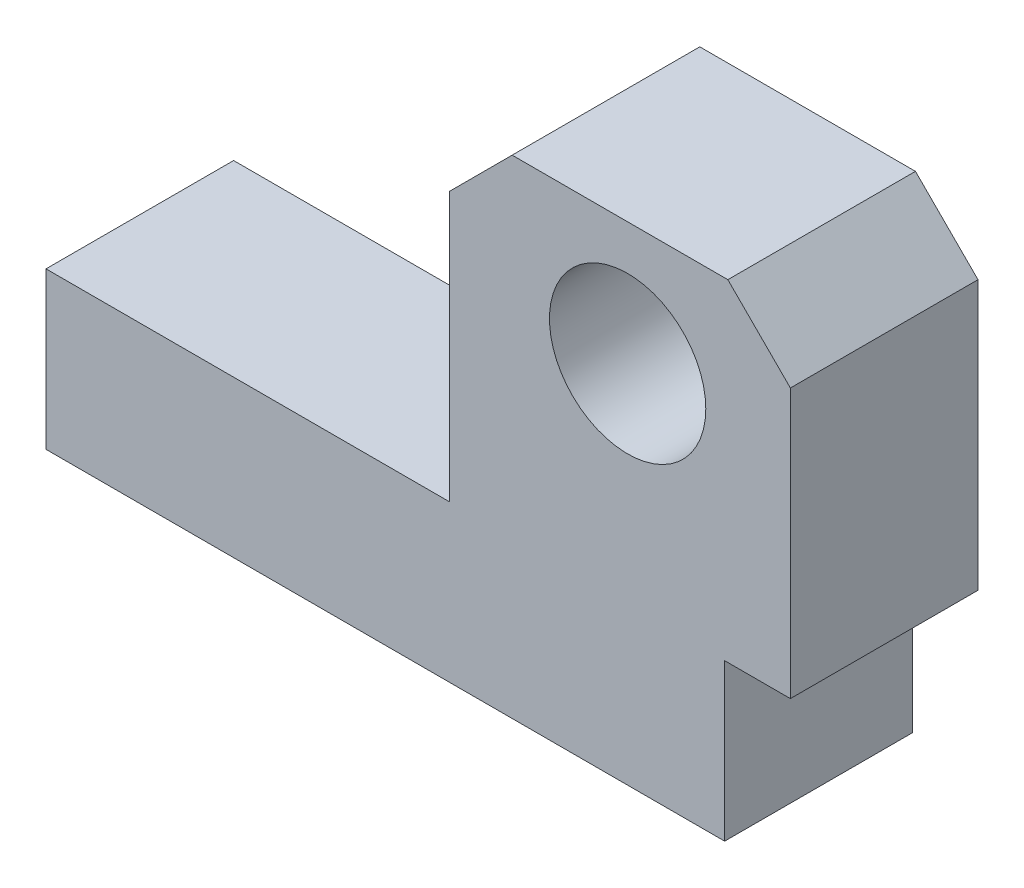
ISO-10303-21;
HEADER;
FILE_DESCRIPTION(('STEP AP214'),'2;1');
FILE_NAME('part.step','',(''),(''),'','','');
FILE_SCHEMA(('AUTOMOTIVE_DESIGN { 1 0 10303 214 1 1 1 1 }'));
ENDSEC;
DATA;
#1=APPLICATION_CONTEXT('core data for automotive mechanical design processes');
#2=APPLICATION_PROTOCOL_DEFINITION('international standard','automotive_design',2000,#1);
#3=PRODUCT_CONTEXT('',#1,'mechanical');
#4=PRODUCT('Part','Part','',(#3));
#5=PRODUCT_RELATED_PRODUCT_CATEGORY('part','',(#4));
#6=PRODUCT_DEFINITION_FORMATION('','',#4);
#7=PRODUCT_DEFINITION_CONTEXT('part definition',#1,'design');
#8=PRODUCT_DEFINITION('design','',#6,#7);
#9=PRODUCT_DEFINITION_SHAPE('','',#8);
#10=(LENGTH_UNIT() NAMED_UNIT(*) SI_UNIT(.MILLI.,.METRE.));
#11=(NAMED_UNIT(*) PLANE_ANGLE_UNIT() SI_UNIT($,.RADIAN.));
#12=(NAMED_UNIT(*) SI_UNIT($,.STERADIAN.) SOLID_ANGLE_UNIT());
#13=UNCERTAINTY_MEASURE_WITH_UNIT(LENGTH_MEASURE(1.E-05),#10,'distance_accuracy_value','');
#14=(GEOMETRIC_REPRESENTATION_CONTEXT(3) GLOBAL_UNCERTAINTY_ASSIGNED_CONTEXT((#13)) GLOBAL_UNIT_ASSIGNED_CONTEXT((#10,
#11,#12)) REPRESENTATION_CONTEXT('',''));
#15=CARTESIAN_POINT('',(0.,0.,0.));
#16=DIRECTION('',(0.,0.,1.));
#17=DIRECTION('',(1.,0.,0.));
#18=AXIS2_PLACEMENT_3D('',#15,#16,#17);
#19=CARTESIAN_POINT('',(-4.73040423180677,5.00000000000064,6.));
#20=DIRECTION('',(0.,0.,-1.));
#21=DIRECTION('',(-1.,0.,0.));
#22=AXIS2_PLACEMENT_3D('',#19,#20,#21);
#23=PLANE('',#22);
#24=DIRECTION('',(0.,-1.,0.));
#25=VECTOR('',#24,1.);
#26=CARTESIAN_POINT('',(-4.73040423180677,6.37890348181847E-13,6.));
#27=LINE('',#26,#25);
#28=CARTESIAN_POINT('',(-4.73040423180677,5.00000000000064,6.));
#29=VERTEX_POINT('',#28);
#30=CARTESIAN_POINT('',(-4.73040423180677,6.37890348181847E-13,6.));
#31=VERTEX_POINT('',#30);
#32=EDGE_CURVE('E160',#29,#31,#27,.T.);
#33=ORIENTED_EDGE('',*,*,#32,.T.);
#34=DIRECTION('',(1.,0.,0.));
#35=VECTOR('',#34,1.);
#36=CARTESIAN_POINT('',(-4.73040423180677,6.37890348181847E-13,6.));
#37=LINE('',#36,#35);
#38=CARTESIAN_POINT('',(16.9727419920189,6.37890348181847E-13,6.));
#39=VERTEX_POINT('',#38);
#40=EDGE_CURVE('E98',#31,#39,#37,.T.);
#41=ORIENTED_EDGE('',*,*,#40,.T.);
#42=DIRECTION('',(0.,1.,0.));
#43=VECTOR('',#42,1.);
#44=CARTESIAN_POINT('',(16.9727419920189,6.37890348181847E-13,6.));
#45=LINE('',#44,#43);
#46=CARTESIAN_POINT('',(16.9727419920189,5.00000000000064,6.));
#47=VERTEX_POINT('',#46);
#48=EDGE_CURVE('E181',#39,#47,#45,.T.);
#49=ORIENTED_EDGE('',*,*,#48,.T.);
#50=DIRECTION('',(1.,0.,0.));
#51=VECTOR('',#50,1.);
#52=CARTESIAN_POINT('',(16.9727419920189,5.00000000000064,6.));
#53=LINE('',#52,#51);
#54=CARTESIAN_POINT('',(19.0752834439527,5.00000000000064,6.));
#55=VERTEX_POINT('',#54);
#56=EDGE_CURVE('E200',#47,#55,#53,.T.);
#57=ORIENTED_EDGE('',*,*,#56,.T.);
#58=DIRECTION('',(0.,1.,0.));
#59=VECTOR('',#58,1.);
#60=CARTESIAN_POINT('',(19.0752834439527,5.00000000000064,6.));
#61=LINE('',#60,#59);
#62=CARTESIAN_POINT('',(19.0752834439527,13.6029787527942,6.));
#63=VERTEX_POINT('',#62);
#64=EDGE_CURVE('E197',#55,#63,#61,.T.);
#65=ORIENTED_EDGE('',*,*,#64,.T.);
#66=DIRECTION('',(-0.707106781186548,0.707106781186547,0.));
#67=VECTOR('',#66,1.);
#68=CARTESIAN_POINT('',(17.0752834439527,15.6029787527942,6.));
#69=LINE('',#68,#67);
#70=CARTESIAN_POINT('',(17.0752834439527,15.6029787527942,6.));
#71=VERTEX_POINT('',#70);
#72=EDGE_CURVE('E199',#63,#71,#69,.T.);
#73=ORIENTED_EDGE('',*,*,#72,.T.);
#74=DIRECTION('',(-1.,0.,0.));
#75=VECTOR('',#74,1.);
#76=CARTESIAN_POINT('',(10.1773140868443,15.6029787527942,6.));
#77=LINE('',#76,#75);
#78=CARTESIAN_POINT('',(10.1773140868443,15.6029787527942,6.));
#79=VERTEX_POINT('',#78);
#80=EDGE_CURVE('E123',#71,#79,#77,.T.);
#81=ORIENTED_EDGE('',*,*,#80,.T.);
#82=DIRECTION('',(-0.707106781186548,-0.707106781186548,0.));
#83=VECTOR('',#82,1.);
#84=CARTESIAN_POINT('',(8.17731408684432,13.6029787527942,6.));
#85=LINE('',#84,#83);
#86=CARTESIAN_POINT('',(8.17731408684432,13.6029787527942,6.));
#87=VERTEX_POINT('',#86);
#88=EDGE_CURVE('E117',#79,#87,#85,.T.);
#89=ORIENTED_EDGE('',*,*,#88,.T.);
#90=DIRECTION('',(0.,-1.,0.));
#91=VECTOR('',#90,1.);
#92=CARTESIAN_POINT('',(8.17731408684432,5.00000000000064,6.));
#93=LINE('',#92,#91);
#94=CARTESIAN_POINT('',(8.17731408684432,5.00000000000064,6.));
#95=VERTEX_POINT('',#94);
#96=EDGE_CURVE('E121',#87,#95,#93,.T.);
#97=ORIENTED_EDGE('',*,*,#96,.T.);
#98=DIRECTION('',(-1.,0.,0.));
#99=VECTOR('',#98,1.);
#100=CARTESIAN_POINT('',(-4.73040423180677,5.00000000000064,6.));
#101=LINE('',#100,#99);
#102=EDGE_CURVE('E49',#95,#29,#101,.T.);
#103=ORIENTED_EDGE('',*,*,#102,.T.);
#104=EDGE_LOOP('',(#33,#41,#49,#57,#65,#73,#81,#89,#97,#103));
#105=FACE_BOUND('',#104,.T.);
#106=CARTESIAN_POINT('',(13.8703064624108,11.6741966457138,6.));
#107=DIRECTION('',(0.,0.,1.));
#108=DIRECTION('',(1.,0.,0.));
#109=AXIS2_PLACEMENT_3D('',#106,#107,#108);
#110=CIRCLE('',#109,2.50000000000015);
#111=CARTESIAN_POINT('',(16.370306462411,11.6741966457138,6.));
#112=VERTEX_POINT('',#111);
#113=EDGE_CURVE('E145',#112,#112,#110,.T.);
#114=ORIENTED_EDGE('',*,*,#113,.F.);
#115=EDGE_LOOP('',(#114));
#116=FACE_BOUND('',#115,.T.);
#117=ADVANCED_FACE('F32',(#105,#116),#23,.F.);
#118=CARTESIAN_POINT('',(-4.73040423180677,5.00000000000064,0.));
#119=DIRECTION('',(0.,0.,-1.));
#120=DIRECTION('',(-1.,0.,0.));
#121=AXIS2_PLACEMENT_3D('',#118,#119,#120);
#122=PLANE('',#121);
#123=DIRECTION('',(0.,-1.,0.));
#124=VECTOR('',#123,1.);
#125=CARTESIAN_POINT('',(-4.73040423180677,6.37890348181847E-13,0.));
#126=LINE('',#125,#124);
#127=CARTESIAN_POINT('',(-4.73040423180677,5.00000000000064,0.));
#128=VERTEX_POINT('',#127);
#129=CARTESIAN_POINT('',(-4.73040423180677,6.37890348181847E-13,0.));
#130=VERTEX_POINT('',#129);
#131=EDGE_CURVE('E141',#128,#130,#126,.T.);
#132=ORIENTED_EDGE('',*,*,#131,.F.);
#133=DIRECTION('',(-1.,0.,0.));
#134=VECTOR('',#133,1.);
#135=CARTESIAN_POINT('',(-4.73040423180677,5.00000000000064,0.));
#136=LINE('',#135,#134);
#137=CARTESIAN_POINT('',(8.17731408684432,5.00000000000064,0.));
#138=VERTEX_POINT('',#137);
#139=EDGE_CURVE('E90',#138,#128,#136,.T.);
#140=ORIENTED_EDGE('',*,*,#139,.F.);
#141=DIRECTION('',(0.,-1.,0.));
#142=VECTOR('',#141,1.);
#143=CARTESIAN_POINT('',(8.17731408684432,5.00000000000064,0.));
#144=LINE('',#143,#142);
#145=CARTESIAN_POINT('',(8.17731408684432,13.6029787527942,0.));
#146=VERTEX_POINT('',#145);
#147=EDGE_CURVE('E84',#146,#138,#144,.T.);
#148=ORIENTED_EDGE('',*,*,#147,.F.);
#149=DIRECTION('',(-0.707106781186548,-0.707106781186548,0.));
#150=VECTOR('',#149,1.);
#151=CARTESIAN_POINT('',(8.17731408684432,13.6029787527942,0.));
#152=LINE('',#151,#150);
#153=CARTESIAN_POINT('',(10.1773140868443,15.6029787527942,0.));
#154=VERTEX_POINT('',#153);
#155=EDGE_CURVE('E131',#154,#146,#152,.T.);
#156=ORIENTED_EDGE('',*,*,#155,.F.);
#157=DIRECTION('',(-1.,0.,0.));
#158=VECTOR('',#157,1.);
#159=CARTESIAN_POINT('',(10.1773140868443,15.6029787527942,0.));
#160=LINE('',#159,#158);
#161=CARTESIAN_POINT('',(17.0752834439527,15.6029787527942,0.));
#162=VERTEX_POINT('',#161);
#163=EDGE_CURVE('E155',#162,#154,#160,.T.);
#164=ORIENTED_EDGE('',*,*,#163,.F.);
#165=DIRECTION('',(-0.707106781186548,0.707106781186547,0.));
#166=VECTOR('',#165,1.);
#167=CARTESIAN_POINT('',(17.0752834439527,15.6029787527942,0.));
#168=LINE('',#167,#166);
#169=CARTESIAN_POINT('',(19.0752834439527,13.6029787527942,0.));
#170=VERTEX_POINT('',#169);
#171=EDGE_CURVE('E153',#170,#162,#168,.T.);
#172=ORIENTED_EDGE('',*,*,#171,.F.);
#173=DIRECTION('',(0.,1.,0.));
#174=VECTOR('',#173,1.);
#175=CARTESIAN_POINT('',(19.0752834439527,5.00000000000064,0.));
#176=LINE('',#175,#174);
#177=CARTESIAN_POINT('',(19.0752834439527,5.00000000000064,0.));
#178=VERTEX_POINT('',#177);
#179=EDGE_CURVE('E151',#178,#170,#176,.T.);
#180=ORIENTED_EDGE('',*,*,#179,.F.);
#181=DIRECTION('',(1.,0.,0.));
#182=VECTOR('',#181,1.);
#183=CARTESIAN_POINT('',(16.9727419920189,5.00000000000064,0.));
#184=LINE('',#183,#182);
#185=CARTESIAN_POINT('',(16.9727419920189,5.00000000000064,0.));
#186=VERTEX_POINT('',#185);
#187=EDGE_CURVE('E149',#186,#178,#184,.T.);
#188=ORIENTED_EDGE('',*,*,#187,.F.);
#189=DIRECTION('',(0.,1.,0.));
#190=VECTOR('',#189,1.);
#191=CARTESIAN_POINT('',(16.9727419920189,6.37890348181847E-13,0.));
#192=LINE('',#191,#190);
#193=CARTESIAN_POINT('',(16.9727419920189,6.37890348181847E-13,0.));
#194=VERTEX_POINT('',#193);
#195=EDGE_CURVE('E147',#194,#186,#192,.T.);
#196=ORIENTED_EDGE('',*,*,#195,.F.);
#197=DIRECTION('',(1.,0.,0.));
#198=VECTOR('',#197,1.);
#199=CARTESIAN_POINT('',(-4.73040423180677,6.37890348181847E-13,0.));
#200=LINE('',#199,#198);
#201=EDGE_CURVE('E144',#130,#194,#200,.T.);
#202=ORIENTED_EDGE('',*,*,#201,.F.);
#203=EDGE_LOOP('',(#132,#140,#148,#156,#164,#172,#180,#188,#196,#202));
#204=FACE_BOUND('',#203,.T.);
#205=CARTESIAN_POINT('',(13.8703064624108,11.6741966457138,0.));
#206=DIRECTION('',(0.,0.,1.));
#207=DIRECTION('',(1.,0.,0.));
#208=AXIS2_PLACEMENT_3D('',#205,#206,#207);
#209=CIRCLE('',#208,2.50000000000015);
#210=CARTESIAN_POINT('',(16.370306462411,11.6741966457138,0.));
#211=VERTEX_POINT('',#210);
#212=EDGE_CURVE('E208',#211,#211,#209,.T.);
#213=ORIENTED_EDGE('',*,*,#212,.T.);
#214=EDGE_LOOP('',(#213));
#215=FACE_BOUND('',#214,.T.);
#216=ADVANCED_FACE('F185',(#204,#215),#122,.T.);
#217=CARTESIAN_POINT('',(-4.73040423180677,6.37890348181847E-13,6.));
#218=DIRECTION('',(1.,0.,0.));
#219=DIRECTION('',(0.,0.,-1.));
#220=AXIS2_PLACEMENT_3D('',#217,#218,#219);
#221=PLANE('',#220);
#222=ORIENTED_EDGE('',*,*,#131,.T.);
#223=DIRECTION('',(0.,0.,-1.));
#224=VECTOR('',#223,1.);
#225=CARTESIAN_POINT('',(-4.73040423180677,6.37890348181847E-13,6.));
#226=LINE('',#225,#224);
#227=EDGE_CURVE('E11',#31,#130,#226,.T.);
#228=ORIENTED_EDGE('',*,*,#227,.F.);
#229=ORIENTED_EDGE('',*,*,#32,.F.);
#230=DIRECTION('',(0.,0.,-1.));
#231=VECTOR('',#230,1.);
#232=CARTESIAN_POINT('',(-4.73040423180677,5.00000000000064,6.));
#233=LINE('',#232,#231);
#234=EDGE_CURVE('E137',#29,#128,#233,.T.);
#235=ORIENTED_EDGE('',*,*,#234,.T.);
#236=EDGE_LOOP('',(#222,#228,#229,#235));
#237=FACE_BOUND('',#236,.T.);
#238=ADVANCED_FACE('F34',(#237),#221,.F.);
#239=CARTESIAN_POINT('',(-4.73040423180677,6.37890348181847E-13,6.));
#240=DIRECTION('',(0.,1.,0.));
#241=DIRECTION('',(0.,0.,1.));
#242=AXIS2_PLACEMENT_3D('',#239,#240,#241);
#243=PLANE('',#242);
#244=ORIENTED_EDGE('',*,*,#201,.T.);
#245=DIRECTION('',(0.,0.,-1.));
#246=VECTOR('',#245,1.);
#247=CARTESIAN_POINT('',(16.9727419920189,6.37890348181847E-13,6.));
#248=LINE('',#247,#246);
#249=EDGE_CURVE('E41',#39,#194,#248,.T.);
#250=ORIENTED_EDGE('',*,*,#249,.F.);
#251=ORIENTED_EDGE('',*,*,#40,.F.);
#252=ORIENTED_EDGE('',*,*,#227,.T.);
#253=EDGE_LOOP('',(#244,#250,#251,#252));
#254=FACE_BOUND('',#253,.T.);
#255=ADVANCED_FACE('F244',(#254),#243,.F.);
#256=CARTESIAN_POINT('',(16.9727419920189,6.37890348181847E-13,6.));
#257=DIRECTION('',(-1.,0.,0.));
#258=DIRECTION('',(0.,0.,1.));
#259=AXIS2_PLACEMENT_3D('',#256,#257,#258);
#260=PLANE('',#259);
#261=ORIENTED_EDGE('',*,*,#195,.T.);
#262=DIRECTION('',(0.,0.,-1.));
#263=VECTOR('',#262,1.);
#264=CARTESIAN_POINT('',(16.9727419920189,5.00000000000064,6.));
#265=LINE('',#264,#263);
#266=EDGE_CURVE('E173',#47,#186,#265,.T.);
#267=ORIENTED_EDGE('',*,*,#266,.F.);
#268=ORIENTED_EDGE('',*,*,#48,.F.);
#269=ORIENTED_EDGE('',*,*,#249,.T.);
#270=EDGE_LOOP('',(#261,#267,#268,#269));
#271=FACE_BOUND('',#270,.T.);
#272=ADVANCED_FACE('F179',(#271),#260,.F.);
#273=CARTESIAN_POINT('',(16.9727419920189,5.00000000000064,6.));
#274=DIRECTION('',(0.,1.,0.));
#275=DIRECTION('',(0.,0.,1.));
#276=AXIS2_PLACEMENT_3D('',#273,#274,#275);
#277=PLANE('',#276);
#278=ORIENTED_EDGE('',*,*,#187,.T.);
#279=DIRECTION('',(0.,0.,-1.));
#280=VECTOR('',#279,1.);
#281=CARTESIAN_POINT('',(19.0752834439527,5.00000000000064,6.));
#282=LINE('',#281,#280);
#283=EDGE_CURVE('E170',#55,#178,#282,.T.);
#284=ORIENTED_EDGE('',*,*,#283,.F.);
#285=ORIENTED_EDGE('',*,*,#56,.F.);
#286=ORIENTED_EDGE('',*,*,#266,.T.);
#287=EDGE_LOOP('',(#278,#284,#285,#286));
#288=FACE_BOUND('',#287,.T.);
#289=ADVANCED_FACE('F191',(#288),#277,.F.);
#290=CARTESIAN_POINT('',(19.0752834439527,5.00000000000064,6.));
#291=DIRECTION('',(-1.,0.,0.));
#292=DIRECTION('',(0.,0.,1.));
#293=AXIS2_PLACEMENT_3D('',#290,#291,#292);
#294=PLANE('',#293);
#295=ORIENTED_EDGE('',*,*,#179,.T.);
#296=DIRECTION('',(0.,0.,-1.));
#297=VECTOR('',#296,1.);
#298=CARTESIAN_POINT('',(19.0752834439527,13.6029787527942,6.));
#299=LINE('',#298,#297);
#300=EDGE_CURVE('E167',#63,#170,#299,.T.);
#301=ORIENTED_EDGE('',*,*,#300,.F.);
#302=ORIENTED_EDGE('',*,*,#64,.F.);
#303=ORIENTED_EDGE('',*,*,#283,.T.);
#304=EDGE_LOOP('',(#295,#301,#302,#303));
#305=FACE_BOUND('',#304,.T.);
#306=ADVANCED_FACE('F195',(#305),#294,.F.);
#307=CARTESIAN_POINT('',(17.0752834439527,15.6029787527942,6.));
#308=DIRECTION('',(-0.707106781186547,-0.707106781186548,0.));
#309=DIRECTION('',(0.707106781186548,-0.707106781186547,0.));
#310=AXIS2_PLACEMENT_3D('',#307,#308,#309);
#311=PLANE('',#310);
#312=ORIENTED_EDGE('',*,*,#171,.T.);
#313=DIRECTION('',(0.,0.,-1.));
#314=VECTOR('',#313,1.);
#315=CARTESIAN_POINT('',(17.0752834439527,15.6029787527942,6.));
#316=LINE('',#315,#314);
#317=EDGE_CURVE('E164',#71,#162,#316,.T.);
#318=ORIENTED_EDGE('',*,*,#317,.F.);
#319=ORIENTED_EDGE('',*,*,#72,.F.);
#320=ORIENTED_EDGE('',*,*,#300,.T.);
#321=EDGE_LOOP('',(#312,#318,#319,#320));
#322=FACE_BOUND('',#321,.T.);
#323=ADVANCED_FACE('F234',(#322),#311,.F.);
#324=CARTESIAN_POINT('',(10.1773140868443,15.6029787527942,6.));
#325=DIRECTION('',(0.,-1.,0.));
#326=DIRECTION('',(0.,0.,-1.));
#327=AXIS2_PLACEMENT_3D('',#324,#325,#326);
#328=PLANE('',#327);
#329=ORIENTED_EDGE('',*,*,#163,.T.);
#330=DIRECTION('',(0.,0.,-1.));
#331=VECTOR('',#330,1.);
#332=CARTESIAN_POINT('',(10.1773140868443,15.6029787527942,6.));
#333=LINE('',#332,#331);
#334=EDGE_CURVE('E132',#79,#154,#333,.T.);
#335=ORIENTED_EDGE('',*,*,#334,.F.);
#336=ORIENTED_EDGE('',*,*,#80,.F.);
#337=ORIENTED_EDGE('',*,*,#317,.T.);
#338=EDGE_LOOP('',(#329,#335,#336,#337));
#339=FACE_BOUND('',#338,.T.);
#340=ADVANCED_FACE('F231',(#339),#328,.F.);
#341=CARTESIAN_POINT('',(8.17731408684432,13.6029787527942,6.));
#342=DIRECTION('',(0.707106781186547,-0.707106781186547,0.));
#343=DIRECTION('',(0.707106781186548,0.707106781186548,0.));
#344=AXIS2_PLACEMENT_3D('',#341,#342,#343);
#345=PLANE('',#344);
#346=ORIENTED_EDGE('',*,*,#155,.T.);
#347=DIRECTION('',(0.,0.,-1.));
#348=VECTOR('',#347,1.);
#349=CARTESIAN_POINT('',(8.17731408684432,13.6029787527942,6.));
#350=LINE('',#349,#348);
#351=EDGE_CURVE('E128',#87,#146,#350,.T.);
#352=ORIENTED_EDGE('',*,*,#351,.F.);
#353=ORIENTED_EDGE('',*,*,#88,.F.);
#354=ORIENTED_EDGE('',*,*,#334,.T.);
#355=EDGE_LOOP('',(#346,#352,#353,#354));
#356=FACE_BOUND('',#355,.T.);
#357=ADVANCED_FACE('F129',(#356),#345,.F.);
#358=CARTESIAN_POINT('',(8.17731408684432,5.00000000000064,6.));
#359=DIRECTION('',(1.,0.,0.));
#360=DIRECTION('',(0.,0.,-1.));
#361=AXIS2_PLACEMENT_3D('',#358,#359,#360);
#362=PLANE('',#361);
#363=ORIENTED_EDGE('',*,*,#147,.T.);
#364=DIRECTION('',(0.,0.,-1.));
#365=VECTOR('',#364,1.);
#366=CARTESIAN_POINT('',(8.17731408684432,5.00000000000064,6.));
#367=LINE('',#366,#365);
#368=EDGE_CURVE('E133',#95,#138,#367,.T.);
#369=ORIENTED_EDGE('',*,*,#368,.F.);
#370=ORIENTED_EDGE('',*,*,#96,.F.);
#371=ORIENTED_EDGE('',*,*,#351,.T.);
#372=EDGE_LOOP('',(#363,#369,#370,#371));
#373=FACE_BOUND('',#372,.T.);
#374=ADVANCED_FACE('F135',(#373),#362,.F.);
#375=CARTESIAN_POINT('',(-4.73040423180677,5.00000000000064,6.));
#376=DIRECTION('',(0.,-1.,0.));
#377=DIRECTION('',(0.,0.,-1.));
#378=AXIS2_PLACEMENT_3D('',#375,#376,#377);
#379=PLANE('',#378);
#380=ORIENTED_EDGE('',*,*,#139,.T.);
#381=ORIENTED_EDGE('',*,*,#234,.F.);
#382=ORIENTED_EDGE('',*,*,#102,.F.);
#383=ORIENTED_EDGE('',*,*,#368,.T.);
#384=EDGE_LOOP('',(#380,#381,#382,#383));
#385=FACE_BOUND('',#384,.T.);
#386=ADVANCED_FACE('F224',(#385),#379,.F.);
#387=CARTESIAN_POINT('',(13.8703064624108,11.6741966457138,6.));
#388=DIRECTION('',(0.,0.,-1.));
#389=DIRECTION('',(-1.,0.,0.));
#390=AXIS2_PLACEMENT_3D('',#387,#388,#389);
#391=CYLINDRICAL_SURFACE('',#390,2.50000000000015);
#392=ORIENTED_EDGE('',*,*,#113,.T.);
#393=EDGE_LOOP('',(#392));
#394=FACE_BOUND('',#393,.T.);
#395=ORIENTED_EDGE('',*,*,#212,.F.);
#396=EDGE_LOOP('',(#395));
#397=FACE_BOUND('',#396,.T.);
#398=ADVANCED_FACE('F214',(#394,#397),#391,.F.);
#399=CLOSED_SHELL('',(#117,#216,#238,#255,#272,#289,#306,#323,#340,#357,#374,#386,#398));
#400=MANIFOLD_SOLID_BREP('B2',#399);
#401=ADVANCED_BREP_SHAPE_REPRESENTATION('',(#18,#400),#14);
#402=SHAPE_DEFINITION_REPRESENTATION(#9,#401);
ENDSEC;
END-ISO-10303-21;
